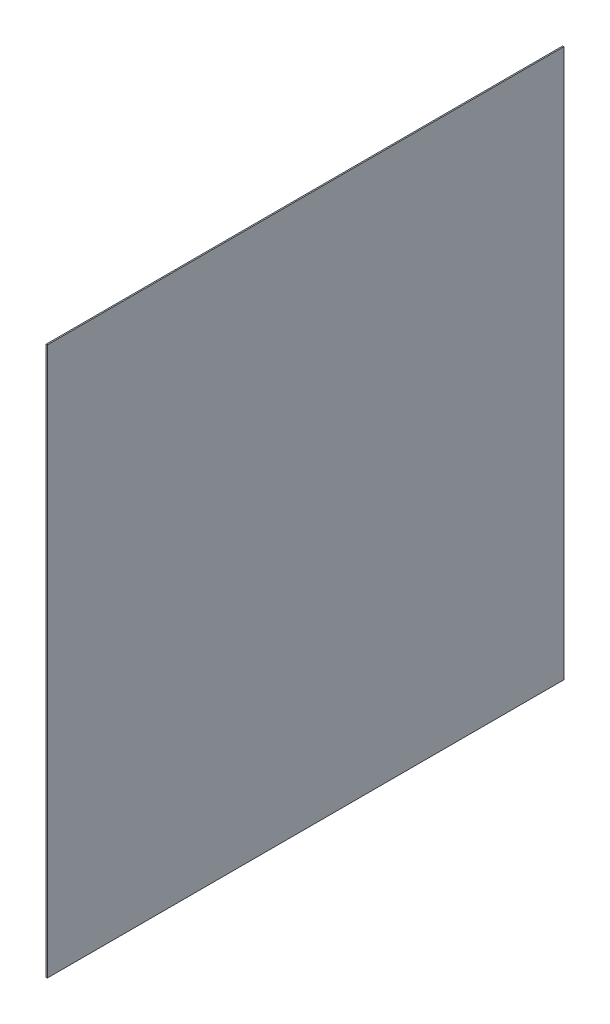
ISO-10303-21;
HEADER;
FILE_DESCRIPTION(('STEP AP214'),'2;1');
FILE_NAME('part.step','',(''),(''),'','','');
FILE_SCHEMA(('AUTOMOTIVE_DESIGN { 1 0 10303 214 1 1 1 1 }'));
ENDSEC;
DATA;
#1=APPLICATION_CONTEXT('core data for automotive mechanical design processes');
#2=APPLICATION_PROTOCOL_DEFINITION('international standard','automotive_design',2000,#1);
#3=PRODUCT_CONTEXT('',#1,'mechanical');
#4=PRODUCT('Part','Part','',(#3));
#5=PRODUCT_RELATED_PRODUCT_CATEGORY('part','',(#4));
#6=PRODUCT_DEFINITION_FORMATION('','',#4);
#7=PRODUCT_DEFINITION_CONTEXT('part definition',#1,'design');
#8=PRODUCT_DEFINITION('design','',#6,#7);
#9=PRODUCT_DEFINITION_SHAPE('','',#8);
#10=(LENGTH_UNIT() NAMED_UNIT(*) SI_UNIT(.MILLI.,.METRE.));
#11=(NAMED_UNIT(*) PLANE_ANGLE_UNIT() SI_UNIT($,.RADIAN.));
#12=(NAMED_UNIT(*) SI_UNIT($,.STERADIAN.) SOLID_ANGLE_UNIT());
#13=UNCERTAINTY_MEASURE_WITH_UNIT(LENGTH_MEASURE(1.E-05),#10,'distance_accuracy_value','');
#14=(GEOMETRIC_REPRESENTATION_CONTEXT(3) GLOBAL_UNCERTAINTY_ASSIGNED_CONTEXT((#13)) GLOBAL_UNIT_ASSIGNED_CONTEXT((#10,
#11,#12)) REPRESENTATION_CONTEXT('',''));
#15=CARTESIAN_POINT('',(0.,0.,0.));
#16=DIRECTION('',(0.,0.,1.));
#17=DIRECTION('',(1.,0.,0.));
#18=AXIS2_PLACEMENT_3D('',#15,#16,#17);
#19=CARTESIAN_POINT('',(5.,1123.5,-1058.));
#20=DIRECTION('',(0.,0.,1.));
#21=DIRECTION('',(0.,-1.,0.));
#22=AXIS2_PLACEMENT_3D('',#19,#20,#21);
#23=PLANE('',#22);
#24=DIRECTION('',(0.,1.,0.));
#25=VECTOR('',#24,1.);
#26=CARTESIAN_POINT('',(0.,1123.5,-1058.));
#27=LINE('',#26,#25);
#28=CARTESIAN_POINT('',(0.,-1123.5,-1058.));
#29=VERTEX_POINT('',#28);
#30=CARTESIAN_POINT('',(0.,1123.5,-1058.));
#31=VERTEX_POINT('',#30);
#32=EDGE_CURVE('E109',#29,#31,#27,.T.);
#33=ORIENTED_EDGE('',*,*,#32,.T.);
#34=DIRECTION('',(-1.,0.,0.));
#35=VECTOR('',#34,1.);
#36=CARTESIAN_POINT('',(5.,1123.5,-1058.));
#37=LINE('',#36,#35);
#38=CARTESIAN_POINT('',(5.,1123.5,-1058.));
#39=VERTEX_POINT('',#38);
#40=EDGE_CURVE('E11',#39,#31,#37,.T.);
#41=ORIENTED_EDGE('',*,*,#40,.F.);
#42=DIRECTION('',(0.,1.,0.));
#43=VECTOR('',#42,1.);
#44=CARTESIAN_POINT('',(5.,1123.5,-1058.));
#45=LINE('',#44,#43);
#46=CARTESIAN_POINT('',(5.,-1123.5,-1058.));
#47=VERTEX_POINT('',#46);
#48=EDGE_CURVE('E93',#47,#39,#45,.T.);
#49=ORIENTED_EDGE('',*,*,#48,.F.);
#50=DIRECTION('',(-1.,0.,0.));
#51=VECTOR('',#50,1.);
#52=CARTESIAN_POINT('',(5.,-1123.5,-1058.));
#53=LINE('',#52,#51);
#54=EDGE_CURVE('E105',#47,#29,#53,.T.);
#55=ORIENTED_EDGE('',*,*,#54,.T.);
#56=EDGE_LOOP('',(#33,#41,#49,#55));
#57=FACE_BOUND('',#56,.T.);
#58=ADVANCED_FACE('F41',(#57),#23,.F.);
#59=CARTESIAN_POINT('',(5.,1123.5,1058.));
#60=DIRECTION('',(0.,-1.,0.));
#61=DIRECTION('',(0.,0.,-1.));
#62=AXIS2_PLACEMENT_3D('',#59,#60,#61);
#63=PLANE('',#62);
#64=DIRECTION('',(0.,0.,1.));
#65=VECTOR('',#64,1.);
#66=CARTESIAN_POINT('',(0.,1123.5,1058.));
#67=LINE('',#66,#65);
#68=CARTESIAN_POINT('',(0.,1123.5,1058.));
#69=VERTEX_POINT('',#68);
#70=EDGE_CURVE('E98',#31,#69,#67,.T.);
#71=ORIENTED_EDGE('',*,*,#70,.T.);
#72=DIRECTION('',(-1.,0.,0.));
#73=VECTOR('',#72,1.);
#74=CARTESIAN_POINT('',(5.,1123.5,1058.));
#75=LINE('',#74,#73);
#76=CARTESIAN_POINT('',(5.,1123.5,1058.));
#77=VERTEX_POINT('',#76);
#78=EDGE_CURVE('E50',#77,#69,#75,.T.);
#79=ORIENTED_EDGE('',*,*,#78,.F.);
#80=DIRECTION('',(0.,0.,1.));
#81=VECTOR('',#80,1.);
#82=CARTESIAN_POINT('',(5.,1123.5,1058.));
#83=LINE('',#82,#81);
#84=EDGE_CURVE('E88',#39,#77,#83,.T.);
#85=ORIENTED_EDGE('',*,*,#84,.F.);
#86=ORIENTED_EDGE('',*,*,#40,.T.);
#87=EDGE_LOOP('',(#71,#79,#85,#86));
#88=FACE_BOUND('',#87,.T.);
#89=ADVANCED_FACE('F97',(#88),#63,.F.);
#90=CARTESIAN_POINT('',(5.,1123.5,1058.));
#91=DIRECTION('',(0.,0.,-1.));
#92=DIRECTION('',(-1.,0.,0.));
#93=AXIS2_PLACEMENT_3D('',#90,#91,#92);
#94=PLANE('',#93);
#95=DIRECTION('',(0.,-1.,0.));
#96=VECTOR('',#95,1.);
#97=CARTESIAN_POINT('',(0.,1123.5,1058.));
#98=LINE('',#97,#96);
#99=CARTESIAN_POINT('',(0.,-1123.5,1058.));
#100=VERTEX_POINT('',#99);
#101=EDGE_CURVE('E75',#69,#100,#98,.T.);
#102=ORIENTED_EDGE('',*,*,#101,.T.);
#103=DIRECTION('',(-1.,0.,0.));
#104=VECTOR('',#103,1.);
#105=CARTESIAN_POINT('',(5.,-1123.5,1058.));
#106=LINE('',#105,#104);
#107=CARTESIAN_POINT('',(5.,-1123.5,1058.));
#108=VERTEX_POINT('',#107);
#109=EDGE_CURVE('E100',#108,#100,#106,.T.);
#110=ORIENTED_EDGE('',*,*,#109,.F.);
#111=DIRECTION('',(0.,-1.,0.));
#112=VECTOR('',#111,1.);
#113=CARTESIAN_POINT('',(5.,1123.5,1058.));
#114=LINE('',#113,#112);
#115=EDGE_CURVE('E91',#77,#108,#114,.T.);
#116=ORIENTED_EDGE('',*,*,#115,.F.);
#117=ORIENTED_EDGE('',*,*,#78,.T.);
#118=EDGE_LOOP('',(#102,#110,#116,#117));
#119=FACE_BOUND('',#118,.T.);
#120=ADVANCED_FACE('F101',(#119),#94,.F.);
#121=CARTESIAN_POINT('',(5.,-1123.5,1058.));
#122=DIRECTION('',(0.,1.,0.));
#123=DIRECTION('',(0.,0.,1.));
#124=AXIS2_PLACEMENT_3D('',#121,#122,#123);
#125=PLANE('',#124);
#126=DIRECTION('',(0.,0.,-1.));
#127=VECTOR('',#126,1.);
#128=CARTESIAN_POINT('',(0.,-1123.5,1058.));
#129=LINE('',#128,#127);
#130=EDGE_CURVE('E81',#100,#29,#129,.T.);
#131=ORIENTED_EDGE('',*,*,#130,.T.);
#132=ORIENTED_EDGE('',*,*,#54,.F.);
#133=DIRECTION('',(0.,0.,-1.));
#134=VECTOR('',#133,1.);
#135=CARTESIAN_POINT('',(5.,-1123.5,1058.));
#136=LINE('',#135,#134);
#137=EDGE_CURVE('E58',#108,#47,#136,.T.);
#138=ORIENTED_EDGE('',*,*,#137,.F.);
#139=ORIENTED_EDGE('',*,*,#109,.T.);
#140=EDGE_LOOP('',(#131,#132,#138,#139));
#141=FACE_BOUND('',#140,.T.);
#142=ADVANCED_FACE('F122',(#141),#125,.F.);
#143=CARTESIAN_POINT('',(5.,0.,0.));
#144=DIRECTION('',(1.,0.,0.));
#145=DIRECTION('',(0.,0.,-1.));
#146=AXIS2_PLACEMENT_3D('',#143,#144,#145);
#147=PLANE('',#146);
#148=ORIENTED_EDGE('',*,*,#48,.T.);
#149=ORIENTED_EDGE('',*,*,#84,.T.);
#150=ORIENTED_EDGE('',*,*,#115,.T.);
#151=ORIENTED_EDGE('',*,*,#137,.T.);
#152=EDGE_LOOP('',(#148,#149,#150,#151));
#153=FACE_BOUND('',#152,.T.);
#154=ADVANCED_FACE('F89',(#153),#147,.T.);
#155=CARTESIAN_POINT('',(0.,0.,0.));
#156=DIRECTION('',(1.,0.,0.));
#157=DIRECTION('',(0.,0.,-1.));
#158=AXIS2_PLACEMENT_3D('',#155,#156,#157);
#159=PLANE('',#158);
#160=ORIENTED_EDGE('',*,*,#32,.F.);
#161=ORIENTED_EDGE('',*,*,#130,.F.);
#162=ORIENTED_EDGE('',*,*,#101,.F.);
#163=ORIENTED_EDGE('',*,*,#70,.F.);
#164=EDGE_LOOP('',(#160,#161,#162,#163));
#165=FACE_BOUND('',#164,.T.);
#166=ADVANCED_FACE('F125',(#165),#159,.F.);
#167=CLOSED_SHELL('',(#58,#89,#120,#142,#154,#166));
#168=MANIFOLD_SOLID_BREP('B2',#167);
#169=ADVANCED_BREP_SHAPE_REPRESENTATION('',(#18,#168),#14);
#170=SHAPE_DEFINITION_REPRESENTATION(#9,#169);
ENDSEC;
END-ISO-10303-21;
